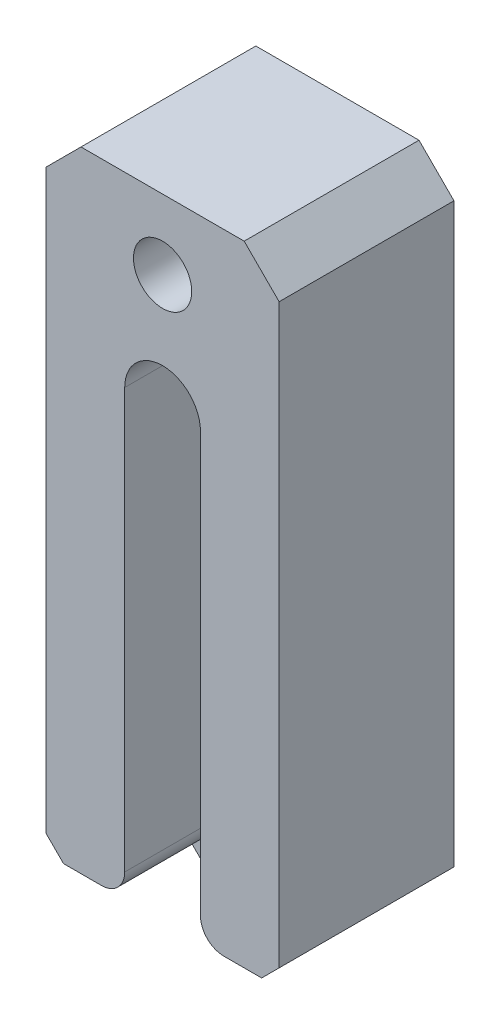
ISO-10303-21;
HEADER;
FILE_DESCRIPTION(('STEP AP214'),'2;1');
FILE_NAME('part.step','',(''),(''),'','','');
FILE_SCHEMA(('AUTOMOTIVE_DESIGN { 1 0 10303 214 1 1 1 1 }'));
ENDSEC;
DATA;
#1=APPLICATION_CONTEXT('core data for automotive mechanical design processes');
#2=APPLICATION_PROTOCOL_DEFINITION('international standard','automotive_design',2000,#1);
#3=PRODUCT_CONTEXT('',#1,'mechanical');
#4=PRODUCT('Part','Part','',(#3));
#5=PRODUCT_RELATED_PRODUCT_CATEGORY('part','',(#4));
#6=PRODUCT_DEFINITION_FORMATION('','',#4);
#7=PRODUCT_DEFINITION_CONTEXT('part definition',#1,'design');
#8=PRODUCT_DEFINITION('design','',#6,#7);
#9=PRODUCT_DEFINITION_SHAPE('','',#8);
#10=(LENGTH_UNIT() NAMED_UNIT(*) SI_UNIT(.MILLI.,.METRE.));
#11=(NAMED_UNIT(*) PLANE_ANGLE_UNIT() SI_UNIT($,.RADIAN.));
#12=(NAMED_UNIT(*) SI_UNIT($,.STERADIAN.) SOLID_ANGLE_UNIT());
#13=UNCERTAINTY_MEASURE_WITH_UNIT(LENGTH_MEASURE(1.E-05),#10,'distance_accuracy_value','');
#14=(GEOMETRIC_REPRESENTATION_CONTEXT(3) GLOBAL_UNCERTAINTY_ASSIGNED_CONTEXT((#13)) GLOBAL_UNIT_ASSIGNED_CONTEXT((#10,
#11,#12)) REPRESENTATION_CONTEXT('',''));
#15=CARTESIAN_POINT('',(0.,0.,0.));
#16=DIRECTION('',(0.,0.,1.));
#17=DIRECTION('',(1.,0.,0.));
#18=AXIS2_PLACEMENT_3D('',#15,#16,#17);
#19=CARTESIAN_POINT('',(10.,12.,0.));
#20=DIRECTION('',(0.,0.,1.));
#21=DIRECTION('',(1.,0.,0.));
#22=AXIS2_PLACEMENT_3D('',#19,#20,#21);
#23=CYLINDRICAL_SURFACE('',#22,3.25);
#24=CARTESIAN_POINT('',(10.,12.,6.));
#25=DIRECTION('',(0.,0.,1.));
#26=DIRECTION('',(1.,0.,0.));
#27=AXIS2_PLACEMENT_3D('',#24,#25,#26);
#28=CIRCLE('',#27,3.25);
#29=CARTESIAN_POINT('',(13.25,12.,6.));
#30=VERTEX_POINT('',#29);
#31=CARTESIAN_POINT('',(6.75,12.,6.));
#32=VERTEX_POINT('',#31);
#33=EDGE_CURVE('E160',#30,#32,#28,.F.);
#34=ORIENTED_EDGE('',*,*,#33,.F.);
#35=DIRECTION('',(0.,0.,1.));
#36=VECTOR('',#35,1.);
#37=CARTESIAN_POINT('',(13.25,12.,0.));
#38=LINE('',#37,#36);
#39=CARTESIAN_POINT('',(13.25,12.,0.));
#40=VERTEX_POINT('',#39);
#41=EDGE_CURVE('E198',#40,#30,#38,.T.);
#42=ORIENTED_EDGE('',*,*,#41,.F.);
#43=CARTESIAN_POINT('',(10.,12.,0.));
#44=DIRECTION('',(0.,0.,1.));
#45=DIRECTION('',(1.,0.,0.));
#46=AXIS2_PLACEMENT_3D('',#43,#44,#45);
#47=CIRCLE('',#46,3.25);
#48=CARTESIAN_POINT('',(6.75,12.,0.));
#49=VERTEX_POINT('',#48);
#50=EDGE_CURVE('E183',#49,#40,#47,.T.);
#51=ORIENTED_EDGE('',*,*,#50,.F.);
#52=DIRECTION('',(0.,0.,1.));
#53=VECTOR('',#52,1.);
#54=CARTESIAN_POINT('',(6.75,12.,0.));
#55=LINE('',#54,#53);
#56=EDGE_CURVE('E177',#49,#32,#55,.T.);
#57=ORIENTED_EDGE('',*,*,#56,.T.);
#58=EDGE_LOOP('',(#34,#42,#51,#57));
#59=FACE_BOUND('',#58,.T.);
#60=ADVANCED_FACE('F32',(#59),#23,.F.);
#61=CARTESIAN_POINT('',(0.,6.,6.));
#62=DIRECTION('',(0.,1.,0.));
#63=DIRECTION('',(0.,0.,1.));
#64=AXIS2_PLACEMENT_3D('',#61,#62,#63);
#65=PLANE('',#64);
#66=DIRECTION('',(-1.,0.,0.));
#67=VECTOR('',#66,1.);
#68=CARTESIAN_POINT('',(0.,6.,6.));
#69=LINE('',#68,#67);
#70=CARTESIAN_POINT('',(4.75,6.,6.));
#71=VERTEX_POINT('',#70);
#72=CARTESIAN_POINT('',(1.5,6.,6.));
#73=VERTEX_POINT('',#72);
#74=EDGE_CURVE('E288',#71,#73,#69,.T.);
#75=ORIENTED_EDGE('',*,*,#74,.F.);
#76=DIRECTION('',(0.,0.,1.));
#77=VECTOR('',#76,1.);
#78=CARTESIAN_POINT('',(4.75,6.,6.));
#79=LINE('',#78,#77);
#80=CARTESIAN_POINT('',(4.75,6.,15.));
#81=VERTEX_POINT('',#80);
#82=EDGE_CURVE('E229',#71,#81,#79,.T.);
#83=ORIENTED_EDGE('',*,*,#82,.T.);
#84=DIRECTION('',(-1.,0.,0.));
#85=VECTOR('',#84,1.);
#86=CARTESIAN_POINT('',(0.,6.,15.));
#87=LINE('',#86,#85);
#88=CARTESIAN_POINT('',(1.5,6.,15.));
#89=VERTEX_POINT('',#88);
#90=EDGE_CURVE('E285',#81,#89,#87,.T.);
#91=ORIENTED_EDGE('',*,*,#90,.T.);
#92=DIRECTION('',(0.,0.,-1.));
#93=VECTOR('',#92,1.);
#94=CARTESIAN_POINT('',(1.5,6.,6.));
#95=LINE('',#94,#93);
#96=EDGE_CURVE('E271',#89,#73,#95,.T.);
#97=ORIENTED_EDGE('',*,*,#96,.T.);
#98=EDGE_LOOP('',(#75,#83,#91,#97));
#99=FACE_BOUND('',#98,.T.);
#100=ADVANCED_FACE('F321',(#99),#65,.F.);
#101=CARTESIAN_POINT('',(0.,0.,15.));
#102=DIRECTION('',(1.,0.,0.));
#103=DIRECTION('',(0.,0.,-1.));
#104=AXIS2_PLACEMENT_3D('',#101,#102,#103);
#105=PLANE('',#104);
#106=DIRECTION('',(0.,-1.,0.));
#107=VECTOR('',#106,1.);
#108=CARTESIAN_POINT('',(0.,0.,15.));
#109=LINE('',#108,#107);
#110=CARTESIAN_POINT('',(0.,57.,15.));
#111=VERTEX_POINT('',#110);
#112=CARTESIAN_POINT('',(0.,7.5,15.));
#113=VERTEX_POINT('',#112);
#114=EDGE_CURVE('E201',#111,#113,#109,.T.);
#115=ORIENTED_EDGE('',*,*,#114,.F.);
#116=DIRECTION('',(0.,0.,-1.));
#117=VECTOR('',#116,1.);
#118=CARTESIAN_POINT('',(0.,57.,15.));
#119=LINE('',#118,#117);
#120=CARTESIAN_POINT('',(0.,57.,0.));
#121=VERTEX_POINT('',#120);
#122=EDGE_CURVE('E11',#111,#121,#119,.T.);
#123=ORIENTED_EDGE('',*,*,#122,.T.);
#124=DIRECTION('',(0.,-1.,0.));
#125=VECTOR('',#124,1.);
#126=CARTESIAN_POINT('',(0.,0.,0.));
#127=LINE('',#126,#125);
#128=CARTESIAN_POINT('',(0.,7.5,0.));
#129=VERTEX_POINT('',#128);
#130=EDGE_CURVE('E185',#121,#129,#127,.T.);
#131=ORIENTED_EDGE('',*,*,#130,.T.);
#132=DIRECTION('',(0.,0.,1.));
#133=VECTOR('',#132,1.);
#134=CARTESIAN_POINT('',(0.,7.5,0.));
#135=LINE('',#134,#133);
#136=EDGE_CURVE('E268',#129,#113,#135,.T.);
#137=ORIENTED_EDGE('',*,*,#136,.T.);
#138=EDGE_LOOP('',(#115,#123,#131,#137));
#139=FACE_BOUND('',#138,.T.);
#140=ADVANCED_FACE('F372',(#139),#105,.F.);
#141=CARTESIAN_POINT('',(0.,0.,15.));
#142=DIRECTION('',(0.,1.,0.));
#143=DIRECTION('',(0.,0.,1.));
#144=AXIS2_PLACEMENT_3D('',#141,#142,#143);
#145=PLANE('',#144);
#146=DIRECTION('',(1.,0.,0.));
#147=VECTOR('',#146,1.);
#148=CARTESIAN_POINT('',(0.,0.,0.));
#149=LINE('',#148,#147);
#150=CARTESIAN_POINT('',(7.5,0.,0.));
#151=VERTEX_POINT('',#150);
#152=CARTESIAN_POINT('',(12.5,0.,0.));
#153=VERTEX_POINT('',#152);
#154=EDGE_CURVE('E188',#151,#153,#149,.T.);
#155=ORIENTED_EDGE('',*,*,#154,.T.);
#156=DIRECTION('',(0.,0.,1.));
#157=VECTOR('',#156,1.);
#158=CARTESIAN_POINT('',(12.5,0.,0.));
#159=LINE('',#158,#157);
#160=CARTESIAN_POINT('',(12.5,0.,6.));
#161=VERTEX_POINT('',#160);
#162=EDGE_CURVE('E267',#153,#161,#159,.T.);
#163=ORIENTED_EDGE('',*,*,#162,.T.);
#164=DIRECTION('',(1.,0.,0.));
#165=VECTOR('',#164,1.);
#166=CARTESIAN_POINT('',(20.,0.,6.));
#167=LINE('',#166,#165);
#168=CARTESIAN_POINT('',(7.5,0.,6.));
#169=VERTEX_POINT('',#168);
#170=EDGE_CURVE('E286',#169,#161,#167,.T.);
#171=ORIENTED_EDGE('',*,*,#170,.F.);
#172=DIRECTION('',(0.,0.,1.));
#173=VECTOR('',#172,1.);
#174=CARTESIAN_POINT('',(7.5,0.,0.));
#175=LINE('',#174,#173);
#176=EDGE_CURVE('E274',#151,#169,#175,.T.);
#177=ORIENTED_EDGE('',*,*,#176,.F.);
#178=EDGE_LOOP('',(#155,#163,#171,#177));
#179=FACE_BOUND('',#178,.T.);
#180=ADVANCED_FACE('F341',(#179),#145,.F.);
#181=CARTESIAN_POINT('',(20.,0.,15.));
#182=DIRECTION('',(-1.,0.,0.));
#183=DIRECTION('',(0.,0.,1.));
#184=AXIS2_PLACEMENT_3D('',#181,#182,#183);
#185=PLANE('',#184);
#186=DIRECTION('',(0.,1.,0.));
#187=VECTOR('',#186,1.);
#188=CARTESIAN_POINT('',(20.,0.,0.));
#189=LINE('',#188,#187);
#190=CARTESIAN_POINT('',(20.,7.5,0.));
#191=VERTEX_POINT('',#190);
#192=CARTESIAN_POINT('',(20.,57.,0.));
#193=VERTEX_POINT('',#192);
#194=EDGE_CURVE('E211',#191,#193,#189,.T.);
#195=ORIENTED_EDGE('',*,*,#194,.T.);
#196=DIRECTION('',(0.,0.,1.));
#197=VECTOR('',#196,1.);
#198=CARTESIAN_POINT('',(20.,57.,15.));
#199=LINE('',#198,#197);
#200=CARTESIAN_POINT('',(20.,57.,15.));
#201=VERTEX_POINT('',#200);
#202=EDGE_CURVE('E55',#193,#201,#199,.T.);
#203=ORIENTED_EDGE('',*,*,#202,.T.);
#204=DIRECTION('',(0.,1.,0.));
#205=VECTOR('',#204,1.);
#206=CARTESIAN_POINT('',(20.,0.,15.));
#207=LINE('',#206,#205);
#208=CARTESIAN_POINT('',(20.,7.5,15.));
#209=VERTEX_POINT('',#208);
#210=EDGE_CURVE('E203',#209,#201,#207,.T.);
#211=ORIENTED_EDGE('',*,*,#210,.F.);
#212=DIRECTION('',(0.,0.,1.));
#213=VECTOR('',#212,1.);
#214=CARTESIAN_POINT('',(20.,7.5,0.));
#215=LINE('',#214,#213);
#216=EDGE_CURVE('E265',#191,#209,#215,.T.);
#217=ORIENTED_EDGE('',*,*,#216,.F.);
#218=EDGE_LOOP('',(#195,#203,#211,#217));
#219=FACE_BOUND('',#218,.T.);
#220=ADVANCED_FACE('F264',(#219),#185,.F.);
#221=CARTESIAN_POINT('',(0.,60.,15.));
#222=DIRECTION('',(0.,-1.,0.));
#223=DIRECTION('',(0.,0.,-1.));
#224=AXIS2_PLACEMENT_3D('',#221,#222,#223);
#225=PLANE('',#224);
#226=DIRECTION('',(-1.,0.,0.));
#227=VECTOR('',#226,1.);
#228=CARTESIAN_POINT('',(0.,60.,15.));
#229=LINE('',#228,#227);
#230=CARTESIAN_POINT('',(17.,60.,15.));
#231=VERTEX_POINT('',#230);
#232=CARTESIAN_POINT('',(3.00000000000002,60.,15.));
#233=VERTEX_POINT('',#232);
#234=EDGE_CURVE('E206',#231,#233,#229,.T.);
#235=ORIENTED_EDGE('',*,*,#234,.F.);
#236=DIRECTION('',(0.,0.,-1.));
#237=VECTOR('',#236,1.);
#238=CARTESIAN_POINT('',(17.,60.,15.));
#239=LINE('',#238,#237);
#240=CARTESIAN_POINT('',(17.,60.,0.));
#241=VERTEX_POINT('',#240);
#242=EDGE_CURVE('E239',#231,#241,#239,.T.);
#243=ORIENTED_EDGE('',*,*,#242,.T.);
#244=DIRECTION('',(-1.,0.,0.));
#245=VECTOR('',#244,1.);
#246=CARTESIAN_POINT('',(0.,60.,0.));
#247=LINE('',#246,#245);
#248=CARTESIAN_POINT('',(3.00000000000002,60.,0.));
#249=VERTEX_POINT('',#248);
#250=EDGE_CURVE('E204',#241,#249,#247,.T.);
#251=ORIENTED_EDGE('',*,*,#250,.T.);
#252=DIRECTION('',(0.,0.,1.));
#253=VECTOR('',#252,1.);
#254=CARTESIAN_POINT('',(3.00000000000002,60.,15.));
#255=LINE('',#254,#253);
#256=EDGE_CURVE('E237',#249,#233,#255,.T.);
#257=ORIENTED_EDGE('',*,*,#256,.T.);
#258=EDGE_LOOP('',(#235,#243,#251,#257));
#259=FACE_BOUND('',#258,.T.);
#260=ADVANCED_FACE('F254',(#259),#225,.F.);
#261=CARTESIAN_POINT('',(0.,0.,15.));
#262=DIRECTION('',(0.,0.,-1.));
#263=DIRECTION('',(-1.,0.,0.));
#264=AXIS2_PLACEMENT_3D('',#261,#262,#263);
#265=PLANE('',#264);
#266=CARTESIAN_POINT('',(10.,54.,15.));
#267=DIRECTION('',(0.,0.,1.));
#268=DIRECTION('',(1.,0.,0.));
#269=AXIS2_PLACEMENT_3D('',#266,#267,#268);
#270=CIRCLE('',#269,2.5);
#271=CARTESIAN_POINT('',(12.5,54.,15.));
#272=VERTEX_POINT('',#271);
#273=EDGE_CURVE('E293',#272,#272,#270,.T.);
#274=ORIENTED_EDGE('',*,*,#273,.F.);
#275=EDGE_LOOP('',(#274));
#276=FACE_BOUND('',#275,.T.);
#277=ORIENTED_EDGE('',*,*,#210,.T.);
#278=DIRECTION('',(0.707106781186546,-0.707106781186549,0.));
#279=VECTOR('',#278,1.);
#280=CARTESIAN_POINT('',(17.,60.,15.));
#281=LINE('',#280,#279);
#282=EDGE_CURVE('E40',#201,#231,#281,.F.);
#283=ORIENTED_EDGE('',*,*,#282,.T.);
#284=ORIENTED_EDGE('',*,*,#234,.T.);
#285=DIRECTION('',(0.70710678118655,0.707106781186545,0.));
#286=VECTOR('',#285,1.);
#287=CARTESIAN_POINT('',(0.,57.,15.));
#288=LINE('',#287,#286);
#289=EDGE_CURVE('E47',#233,#111,#288,.F.);
#290=ORIENTED_EDGE('',*,*,#289,.T.);
#291=ORIENTED_EDGE('',*,*,#114,.T.);
#292=DIRECTION('',(-0.707106781186548,0.707106781186547,0.));
#293=VECTOR('',#292,1.);
#294=CARTESIAN_POINT('',(7.5,0.,15.));
#295=LINE('',#294,#293);
#296=EDGE_CURVE('E171',#89,#113,#295,.T.);
#297=ORIENTED_EDGE('',*,*,#296,.F.);
#298=ORIENTED_EDGE('',*,*,#90,.F.);
#299=CARTESIAN_POINT('',(4.75,8.,15.));
#300=DIRECTION('',(0.,0.,-1.));
#301=DIRECTION('',(-1.,0.,0.));
#302=AXIS2_PLACEMENT_3D('',#299,#300,#301);
#303=CIRCLE('',#302,2.);
#304=CARTESIAN_POINT('',(6.75,8.,15.));
#305=VERTEX_POINT('',#304);
#306=EDGE_CURVE('E223',#81,#305,#303,.F.);
#307=ORIENTED_EDGE('',*,*,#306,.T.);
#308=DIRECTION('',(0.,-1.,0.));
#309=VECTOR('',#308,1.);
#310=CARTESIAN_POINT('',(6.75,12.,15.));
#311=LINE('',#310,#309);
#312=CARTESIAN_POINT('',(6.75,44.,15.));
#313=VERTEX_POINT('',#312);
#314=EDGE_CURVE('E193',#313,#305,#311,.T.);
#315=ORIENTED_EDGE('',*,*,#314,.F.);
#316=CARTESIAN_POINT('',(10.,44.,15.));
#317=DIRECTION('',(0.,0.,1.));
#318=DIRECTION('',(1.,0.,0.));
#319=AXIS2_PLACEMENT_3D('',#316,#317,#318);
#320=CIRCLE('',#319,3.25);
#321=CARTESIAN_POINT('',(13.25,44.,15.));
#322=VERTEX_POINT('',#321);
#323=EDGE_CURVE('E310',#322,#313,#320,.T.);
#324=ORIENTED_EDGE('',*,*,#323,.F.);
#325=DIRECTION('',(0.,1.,0.));
#326=VECTOR('',#325,1.);
#327=CARTESIAN_POINT('',(13.25,12.,15.));
#328=LINE('',#327,#326);
#329=CARTESIAN_POINT('',(13.25,8.,15.));
#330=VERTEX_POINT('',#329);
#331=EDGE_CURVE('E299',#330,#322,#328,.T.);
#332=ORIENTED_EDGE('',*,*,#331,.F.);
#333=CARTESIAN_POINT('',(15.25,8.,15.));
#334=DIRECTION('',(0.,0.,-1.));
#335=DIRECTION('',(-1.,0.,0.));
#336=AXIS2_PLACEMENT_3D('',#333,#334,#335);
#337=CIRCLE('',#336,2.);
#338=CARTESIAN_POINT('',(15.25,6.,15.));
#339=VERTEX_POINT('',#338);
#340=EDGE_CURVE('E225',#330,#339,#337,.F.);
#341=ORIENTED_EDGE('',*,*,#340,.T.);
#342=CARTESIAN_POINT('',(18.5,6.,15.));
#343=VERTEX_POINT('',#342);
#344=EDGE_CURVE('E289',#343,#339,#87,.T.);
#345=ORIENTED_EDGE('',*,*,#344,.F.);
#346=DIRECTION('',(-0.707106781186548,-0.707106781186547,0.));
#347=VECTOR('',#346,1.);
#348=CARTESIAN_POINT('',(20.,7.5,15.));
#349=LINE('',#348,#347);
#350=EDGE_CURVE('E329',#209,#343,#349,.T.);
#351=ORIENTED_EDGE('',*,*,#350,.F.);
#352=EDGE_LOOP('',(#277,#283,#284,#290,#291,#297,#298,#307,#315,#324,#332,#341,#345,#351));
#353=FACE_BOUND('',#352,.T.);
#354=ADVANCED_FACE('F249',(#276,#353),#265,.F.);
#355=CARTESIAN_POINT('',(0.,0.,0.));
#356=DIRECTION('',(0.,0.,-1.));
#357=DIRECTION('',(-1.,0.,0.));
#358=AXIS2_PLACEMENT_3D('',#355,#356,#357);
#359=PLANE('',#358);
#360=ORIENTED_EDGE('',*,*,#250,.F.);
#361=DIRECTION('',(-0.707106781186546,0.707106781186549,0.));
#362=VECTOR('',#361,1.);
#363=CARTESIAN_POINT('',(38.5,38.4999999999998,0.));
#364=LINE('',#363,#362);
#365=EDGE_CURVE('E244',#241,#193,#364,.F.);
#366=ORIENTED_EDGE('',*,*,#365,.T.);
#367=ORIENTED_EDGE('',*,*,#194,.F.);
#368=DIRECTION('',(-0.707106781186548,-0.707106781186547,0.));
#369=VECTOR('',#368,1.);
#370=CARTESIAN_POINT('',(20.,7.5,0.));
#371=LINE('',#370,#369);
#372=EDGE_CURVE('E279',#191,#153,#371,.T.);
#373=ORIENTED_EDGE('',*,*,#372,.T.);
#374=ORIENTED_EDGE('',*,*,#154,.F.);
#375=DIRECTION('',(-0.707106781186548,0.707106781186547,0.));
#376=VECTOR('',#375,1.);
#377=CARTESIAN_POINT('',(7.5,0.,0.));
#378=LINE('',#377,#376);
#379=EDGE_CURVE('E331',#151,#129,#378,.T.);
#380=ORIENTED_EDGE('',*,*,#379,.T.);
#381=ORIENTED_EDGE('',*,*,#130,.F.);
#382=DIRECTION('',(-0.70710678118655,-0.707106781186545,0.));
#383=VECTOR('',#382,1.);
#384=CARTESIAN_POINT('',(-28.5,28.5000000000002,0.));
#385=LINE('',#384,#383);
#386=EDGE_CURVE('E242',#121,#249,#385,.F.);
#387=ORIENTED_EDGE('',*,*,#386,.T.);
#388=EDGE_LOOP('',(#360,#366,#367,#373,#374,#380,#381,#387));
#389=FACE_BOUND('',#388,.T.);
#390=CARTESIAN_POINT('',(10.,54.,0.));
#391=DIRECTION('',(0.,0.,1.));
#392=DIRECTION('',(1.,0.,0.));
#393=AXIS2_PLACEMENT_3D('',#390,#391,#392);
#394=CIRCLE('',#393,2.5);
#395=CARTESIAN_POINT('',(12.5,54.,0.));
#396=VERTEX_POINT('',#395);
#397=EDGE_CURVE('E296',#396,#396,#394,.T.);
#398=ORIENTED_EDGE('',*,*,#397,.T.);
#399=EDGE_LOOP('',(#398));
#400=FACE_BOUND('',#399,.T.);
#401=ORIENTED_EDGE('',*,*,#50,.T.);
#402=DIRECTION('',(0.,1.,0.));
#403=VECTOR('',#402,1.);
#404=CARTESIAN_POINT('',(13.25,12.,0.));
#405=LINE('',#404,#403);
#406=CARTESIAN_POINT('',(13.25,44.,0.));
#407=VERTEX_POINT('',#406);
#408=EDGE_CURVE('E303',#40,#407,#405,.T.);
#409=ORIENTED_EDGE('',*,*,#408,.T.);
#410=CARTESIAN_POINT('',(10.,44.,0.));
#411=DIRECTION('',(0.,0.,1.));
#412=DIRECTION('',(1.,0.,0.));
#413=AXIS2_PLACEMENT_3D('',#410,#411,#412);
#414=CIRCLE('',#413,3.25);
#415=CARTESIAN_POINT('',(6.75,44.,0.));
#416=VERTEX_POINT('',#415);
#417=EDGE_CURVE('E306',#407,#416,#414,.T.);
#418=ORIENTED_EDGE('',*,*,#417,.T.);
#419=DIRECTION('',(0.,-1.,0.));
#420=VECTOR('',#419,1.);
#421=CARTESIAN_POINT('',(6.75,12.,0.));
#422=LINE('',#421,#420);
#423=EDGE_CURVE('E200',#416,#49,#422,.T.);
#424=ORIENTED_EDGE('',*,*,#423,.T.);
#425=EDGE_LOOP('',(#401,#409,#418,#424));
#426=FACE_BOUND('',#425,.T.);
#427=ADVANCED_FACE('F260',(#389,#400,#426),#359,.T.);
#428=CARTESIAN_POINT('',(6.75,12.,0.));
#429=DIRECTION('',(-1.,0.,0.));
#430=DIRECTION('',(0.,0.,1.));
#431=AXIS2_PLACEMENT_3D('',#428,#429,#430);
#432=PLANE('',#431);
#433=ORIENTED_EDGE('',*,*,#314,.T.);
#434=DIRECTION('',(0.,0.,1.));
#435=VECTOR('',#434,1.);
#436=CARTESIAN_POINT('',(6.75,8.,0.));
#437=LINE('',#436,#435);
#438=CARTESIAN_POINT('',(6.75,8.,6.));
#439=VERTEX_POINT('',#438);
#440=EDGE_CURVE('E180',#305,#439,#437,.F.);
#441=ORIENTED_EDGE('',*,*,#440,.T.);
#442=DIRECTION('',(0.,-1.,0.));
#443=VECTOR('',#442,1.);
#444=CARTESIAN_POINT('',(6.75,14.,6.));
#445=LINE('',#444,#443);
#446=EDGE_CURVE('E164',#32,#439,#445,.T.);
#447=ORIENTED_EDGE('',*,*,#446,.F.);
#448=ORIENTED_EDGE('',*,*,#56,.F.);
#449=ORIENTED_EDGE('',*,*,#423,.F.);
#450=DIRECTION('',(0.,0.,1.));
#451=VECTOR('',#450,1.);
#452=CARTESIAN_POINT('',(6.75,44.,0.));
#453=LINE('',#452,#451);
#454=EDGE_CURVE('E186',#416,#313,#453,.T.);
#455=ORIENTED_EDGE('',*,*,#454,.T.);
#456=EDGE_LOOP('',(#433,#441,#447,#448,#449,#455));
#457=FACE_BOUND('',#456,.T.);
#458=ADVANCED_FACE('F175',(#457),#432,.F.);
#459=CARTESIAN_POINT('',(10.,44.,0.));
#460=DIRECTION('',(0.,0.,1.));
#461=DIRECTION('',(1.,0.,0.));
#462=AXIS2_PLACEMENT_3D('',#459,#460,#461);
#463=CYLINDRICAL_SURFACE('',#462,3.25);
#464=ORIENTED_EDGE('',*,*,#323,.T.);
#465=ORIENTED_EDGE('',*,*,#454,.F.);
#466=ORIENTED_EDGE('',*,*,#417,.F.);
#467=DIRECTION('',(0.,0.,1.));
#468=VECTOR('',#467,1.);
#469=CARTESIAN_POINT('',(13.25,44.,0.));
#470=LINE('',#469,#468);
#471=EDGE_CURVE('E190',#407,#322,#470,.T.);
#472=ORIENTED_EDGE('',*,*,#471,.T.);
#473=EDGE_LOOP('',(#464,#465,#466,#472));
#474=FACE_BOUND('',#473,.T.);
#475=ADVANCED_FACE('F357',(#474),#463,.F.);
#476=CARTESIAN_POINT('',(13.25,12.,0.));
#477=DIRECTION('',(1.,0.,0.));
#478=DIRECTION('',(0.,0.,-1.));
#479=AXIS2_PLACEMENT_3D('',#476,#477,#478);
#480=PLANE('',#479);
#481=DIRECTION('',(0.,1.,0.));
#482=VECTOR('',#481,1.);
#483=CARTESIAN_POINT('',(13.25,14.,6.));
#484=LINE('',#483,#482);
#485=CARTESIAN_POINT('',(13.25,8.,6.));
#486=VERTEX_POINT('',#485);
#487=EDGE_CURVE('E167',#486,#30,#484,.T.);
#488=ORIENTED_EDGE('',*,*,#487,.F.);
#489=DIRECTION('',(0.,0.,1.));
#490=VECTOR('',#489,1.);
#491=CARTESIAN_POINT('',(13.25,8.,0.));
#492=LINE('',#491,#490);
#493=EDGE_CURVE('E220',#486,#330,#492,.T.);
#494=ORIENTED_EDGE('',*,*,#493,.T.);
#495=ORIENTED_EDGE('',*,*,#331,.T.);
#496=ORIENTED_EDGE('',*,*,#471,.F.);
#497=ORIENTED_EDGE('',*,*,#408,.F.);
#498=ORIENTED_EDGE('',*,*,#41,.T.);
#499=EDGE_LOOP('',(#488,#494,#495,#496,#497,#498));
#500=FACE_BOUND('',#499,.T.);
#501=ADVANCED_FACE('F352',(#500),#480,.F.);
#502=CARTESIAN_POINT('',(10.,54.,0.));
#503=DIRECTION('',(0.,0.,1.));
#504=DIRECTION('',(1.,0.,0.));
#505=AXIS2_PLACEMENT_3D('',#502,#503,#504);
#506=CYLINDRICAL_SURFACE('',#505,2.5);
#507=ORIENTED_EDGE('',*,*,#397,.F.);
#508=EDGE_LOOP('',(#507));
#509=FACE_BOUND('',#508,.T.);
#510=ORIENTED_EDGE('',*,*,#273,.T.);
#511=EDGE_LOOP('',(#510));
#512=FACE_BOUND('',#511,.T.);
#513=ADVANCED_FACE('F468',(#509,#512),#506,.F.);
#514=ORIENTED_EDGE('',*,*,#344,.T.);
#515=DIRECTION('',(0.,0.,1.));
#516=VECTOR('',#515,1.);
#517=CARTESIAN_POINT('',(15.25,6.,6.));
#518=LINE('',#517,#516);
#519=CARTESIAN_POINT('',(15.25,6.,6.));
#520=VERTEX_POINT('',#519);
#521=EDGE_CURVE('E227',#339,#520,#518,.F.);
#522=ORIENTED_EDGE('',*,*,#521,.T.);
#523=CARTESIAN_POINT('',(18.5,6.,6.));
#524=VERTEX_POINT('',#523);
#525=EDGE_CURVE('E290',#524,#520,#69,.T.);
#526=ORIENTED_EDGE('',*,*,#525,.F.);
#527=DIRECTION('',(0.,0.,1.));
#528=VECTOR('',#527,1.);
#529=CARTESIAN_POINT('',(18.5,6.,6.));
#530=LINE('',#529,#528);
#531=EDGE_CURVE('E282',#524,#343,#530,.T.);
#532=ORIENTED_EDGE('',*,*,#531,.T.);
#533=EDGE_LOOP('',(#514,#522,#526,#532));
#534=FACE_BOUND('',#533,.T.);
#535=ADVANCED_FACE('F345',(#534),#65,.F.);
#536=CARTESIAN_POINT('',(0.,0.,6.));
#537=DIRECTION('',(0.,0.,-1.));
#538=DIRECTION('',(-1.,0.,0.));
#539=AXIS2_PLACEMENT_3D('',#536,#537,#538);
#540=PLANE('',#539);
#541=ORIENTED_EDGE('',*,*,#170,.T.);
#542=DIRECTION('',(0.707106781186548,0.707106781186547,0.));
#543=VECTOR('',#542,1.);
#544=CARTESIAN_POINT('',(6.25,-6.25,6.));
#545=LINE('',#544,#543);
#546=EDGE_CURVE('E217',#161,#524,#545,.T.);
#547=ORIENTED_EDGE('',*,*,#546,.T.);
#548=ORIENTED_EDGE('',*,*,#525,.T.);
#549=CARTESIAN_POINT('',(15.25,8.,6.));
#550=DIRECTION('',(0.,0.,-1.));
#551=DIRECTION('',(-1.,0.,0.));
#552=AXIS2_PLACEMENT_3D('',#549,#550,#551);
#553=CIRCLE('',#552,2.);
#554=EDGE_CURVE('E233',#520,#486,#553,.T.);
#555=ORIENTED_EDGE('',*,*,#554,.T.);
#556=ORIENTED_EDGE('',*,*,#487,.T.);
#557=ORIENTED_EDGE('',*,*,#33,.T.);
#558=ORIENTED_EDGE('',*,*,#446,.T.);
#559=CARTESIAN_POINT('',(4.75,8.,6.));
#560=DIRECTION('',(0.,0.,-1.));
#561=DIRECTION('',(-1.,0.,0.));
#562=AXIS2_PLACEMENT_3D('',#559,#560,#561);
#563=CIRCLE('',#562,2.);
#564=EDGE_CURVE('E235',#439,#71,#563,.T.);
#565=ORIENTED_EDGE('',*,*,#564,.T.);
#566=ORIENTED_EDGE('',*,*,#74,.T.);
#567=DIRECTION('',(0.707106781186548,-0.707106781186547,0.));
#568=VECTOR('',#567,1.);
#569=CARTESIAN_POINT('',(3.75,3.75,6.));
#570=LINE('',#569,#568);
#571=EDGE_CURVE('E207',#73,#169,#570,.T.);
#572=ORIENTED_EDGE('',*,*,#571,.T.);
#573=EDGE_LOOP('',(#541,#547,#548,#555,#556,#557,#558,#565,#566,#572));
#574=FACE_BOUND('',#573,.T.);
#575=ADVANCED_FACE('F163',(#574),#540,.F.);
#576=CARTESIAN_POINT('',(7.5,0.,0.));
#577=DIRECTION('',(0.707106781186547,0.707106781186548,0.));
#578=DIRECTION('',(-0.707106781186548,0.707106781186547,0.));
#579=AXIS2_PLACEMENT_3D('',#576,#577,#578);
#580=PLANE('',#579);
#581=ORIENTED_EDGE('',*,*,#296,.T.);
#582=ORIENTED_EDGE('',*,*,#136,.F.);
#583=ORIENTED_EDGE('',*,*,#379,.F.);
#584=ORIENTED_EDGE('',*,*,#176,.T.);
#585=ORIENTED_EDGE('',*,*,#571,.F.);
#586=ORIENTED_EDGE('',*,*,#96,.F.);
#587=EDGE_LOOP('',(#581,#582,#583,#584,#585,#586));
#588=FACE_BOUND('',#587,.T.);
#589=ADVANCED_FACE('F327',(#588),#580,.F.);
#590=CARTESIAN_POINT('',(20.,7.5,0.));
#591=DIRECTION('',(-0.707106781186547,0.707106781186548,0.));
#592=DIRECTION('',(-0.707106781186548,-0.707106781186547,0.));
#593=AXIS2_PLACEMENT_3D('',#590,#591,#592);
#594=PLANE('',#593);
#595=ORIENTED_EDGE('',*,*,#546,.F.);
#596=ORIENTED_EDGE('',*,*,#162,.F.);
#597=ORIENTED_EDGE('',*,*,#372,.F.);
#598=ORIENTED_EDGE('',*,*,#216,.T.);
#599=ORIENTED_EDGE('',*,*,#350,.T.);
#600=ORIENTED_EDGE('',*,*,#531,.F.);
#601=EDGE_LOOP('',(#595,#596,#597,#598,#599,#600));
#602=FACE_BOUND('',#601,.T.);
#603=ADVANCED_FACE('F358',(#602),#594,.F.);
#604=CARTESIAN_POINT('',(15.25,8.,0.));
#605=DIRECTION('',(0.,0.,1.));
#606=DIRECTION('',(1.,0.,0.));
#607=AXIS2_PLACEMENT_3D('',#604,#605,#606);
#608=CYLINDRICAL_SURFACE('',#607,2.);
#609=ORIENTED_EDGE('',*,*,#554,.F.);
#610=ORIENTED_EDGE('',*,*,#521,.F.);
#611=ORIENTED_EDGE('',*,*,#340,.F.);
#612=ORIENTED_EDGE('',*,*,#493,.F.);
#613=EDGE_LOOP('',(#609,#610,#611,#612));
#614=FACE_BOUND('',#613,.T.);
#615=ADVANCED_FACE('F349',(#614),#608,.T.);
#616=CARTESIAN_POINT('',(4.75,8.,6.));
#617=DIRECTION('',(0.,0.,1.));
#618=DIRECTION('',(1.,0.,0.));
#619=AXIS2_PLACEMENT_3D('',#616,#617,#618);
#620=CYLINDRICAL_SURFACE('',#619,2.);
#621=ORIENTED_EDGE('',*,*,#564,.F.);
#622=ORIENTED_EDGE('',*,*,#440,.F.);
#623=ORIENTED_EDGE('',*,*,#306,.F.);
#624=ORIENTED_EDGE('',*,*,#82,.F.);
#625=EDGE_LOOP('',(#621,#622,#623,#624));
#626=FACE_BOUND('',#625,.T.);
#627=ADVANCED_FACE('F316',(#626),#620,.T.);
#628=CARTESIAN_POINT('',(17.,60.,15.));
#629=DIRECTION('',(-0.707106781186549,-0.707106781186546,0.));
#630=DIRECTION('',(0.,0.,-1.));
#631=AXIS2_PLACEMENT_3D('',#628,#629,#630);
#632=PLANE('',#631);
#633=ORIENTED_EDGE('',*,*,#282,.F.);
#634=ORIENTED_EDGE('',*,*,#202,.F.);
#635=ORIENTED_EDGE('',*,*,#365,.F.);
#636=ORIENTED_EDGE('',*,*,#242,.F.);
#637=EDGE_LOOP('',(#633,#634,#635,#636));
#638=FACE_BOUND('',#637,.T.);
#639=ADVANCED_FACE('F257',(#638),#632,.F.);
#640=CARTESIAN_POINT('',(0.,57.,15.));
#641=DIRECTION('',(0.707106781186545,-0.70710678118655,0.));
#642=DIRECTION('',(0.,0.,-1.));
#643=AXIS2_PLACEMENT_3D('',#640,#641,#642);
#644=PLANE('',#643);
#645=ORIENTED_EDGE('',*,*,#289,.F.);
#646=ORIENTED_EDGE('',*,*,#256,.F.);
#647=ORIENTED_EDGE('',*,*,#386,.F.);
#648=ORIENTED_EDGE('',*,*,#122,.F.);
#649=EDGE_LOOP('',(#645,#646,#647,#648));
#650=FACE_BOUND('',#649,.T.);
#651=ADVANCED_FACE('F34',(#650),#644,.F.);
#652=CLOSED_SHELL('',(#60,#100,#140,#180,#220,#260,#354,#427,#458,#475,#501,#513,#535,#575,#589,
#603,#615,#627,#639,#651));
#653=MANIFOLD_SOLID_BREP('B2',#652);
#654=ADVANCED_BREP_SHAPE_REPRESENTATION('',(#18,#653),#14);
#655=SHAPE_DEFINITION_REPRESENTATION(#9,#654);
ENDSEC;
END-ISO-10303-21;
